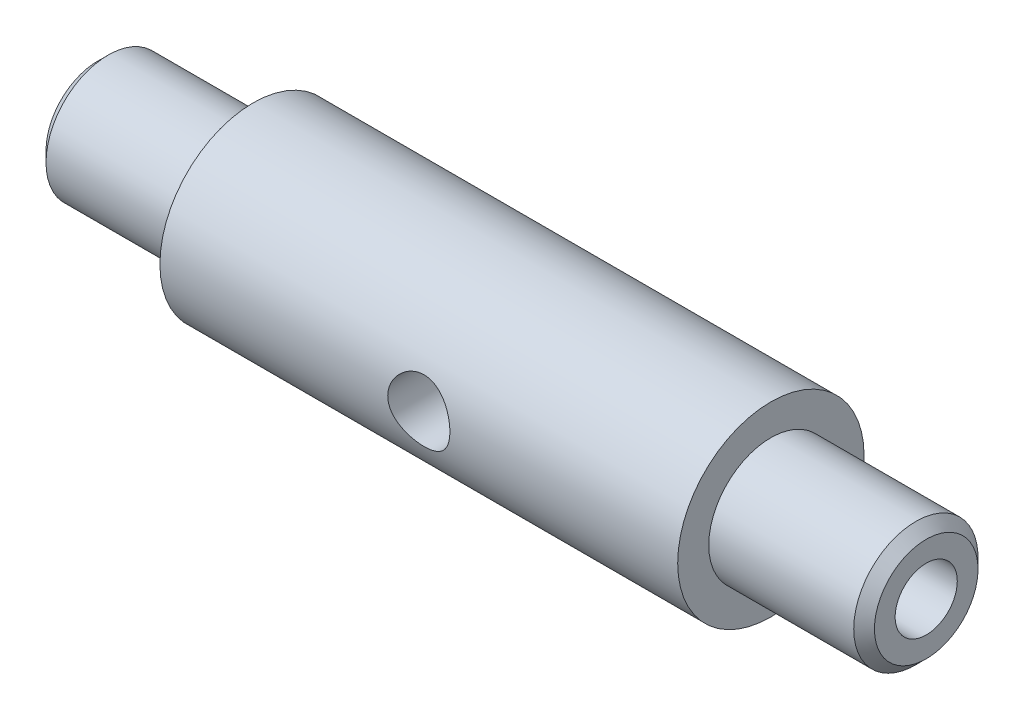
ISO-10303-21;
HEADER;
FILE_DESCRIPTION(('STEP AP214'),'2;1');
FILE_NAME('part.step','',(''),(''),'','','');
FILE_SCHEMA(('AUTOMOTIVE_DESIGN { 1 0 10303 214 1 1 1 1 }'));
ENDSEC;
DATA;
#1=APPLICATION_CONTEXT('core data for automotive mechanical design processes');
#2=APPLICATION_PROTOCOL_DEFINITION('international standard','automotive_design',2000,#1);
#3=PRODUCT_CONTEXT('',#1,'mechanical');
#4=PRODUCT('Part','Part','',(#3));
#5=PRODUCT_RELATED_PRODUCT_CATEGORY('part','',(#4));
#6=PRODUCT_DEFINITION_FORMATION('','',#4);
#7=PRODUCT_DEFINITION_CONTEXT('part definition',#1,'design');
#8=PRODUCT_DEFINITION('design','',#6,#7);
#9=PRODUCT_DEFINITION_SHAPE('','',#8);
#10=(LENGTH_UNIT() NAMED_UNIT(*) SI_UNIT(.MILLI.,.METRE.));
#11=(NAMED_UNIT(*) PLANE_ANGLE_UNIT() SI_UNIT($,.RADIAN.));
#12=(NAMED_UNIT(*) SI_UNIT($,.STERADIAN.) SOLID_ANGLE_UNIT());
#13=UNCERTAINTY_MEASURE_WITH_UNIT(LENGTH_MEASURE(1.E-05),#10,'distance_accuracy_value','');
#14=(GEOMETRIC_REPRESENTATION_CONTEXT(3) GLOBAL_UNCERTAINTY_ASSIGNED_CONTEXT((#13)) GLOBAL_UNIT_ASSIGNED_CONTEXT((#10,
#11,#12)) REPRESENTATION_CONTEXT('',''));
#15=CARTESIAN_POINT('',(0.,0.,0.));
#16=DIRECTION('',(0.,0.,1.));
#17=DIRECTION('',(1.,0.,0.));
#18=AXIS2_PLACEMENT_3D('',#15,#16,#17);
#19=CARTESIAN_POINT('',(0.,0.,22.));
#20=DIRECTION('',(0.,0.,-1.));
#21=DIRECTION('',(-1.,0.,0.));
#22=AXIS2_PLACEMENT_3D('',#19,#20,#21);
#23=CYLINDRICAL_SURFACE('',#22,3.);
#24=CARTESIAN_POINT('',(0.,0.,0.));
#25=DIRECTION('',(0.707106781186547,0.,-0.707106781186548));
#26=DIRECTION('',(-0.707106781186547,0.,-0.707106781186548));
#27=AXIS2_PLACEMENT_3D('',#24,#25,#26);
#28=ELLIPSE('',#27,4.24264068711929,3.);
#29=CARTESIAN_POINT('',(0.,-3.,0.));
#30=VERTEX_POINT('',#29);
#31=CARTESIAN_POINT('',(0.,3.,0.));
#32=VERTEX_POINT('',#31);
#33=EDGE_CURVE('E11',#30,#32,#28,.F.);
#34=ORIENTED_EDGE('',*,*,#33,.F.);
#35=CARTESIAN_POINT('',(0.,0.,0.));
#36=DIRECTION('',(-0.707106781186547,0.,-0.707106781186548));
#37=DIRECTION('',(0.707106781186547,0.,-0.707106781186548));
#38=AXIS2_PLACEMENT_3D('',#35,#36,#37);
#39=ELLIPSE('',#38,4.24264068711929,3.);
#40=EDGE_CURVE('E58',#32,#30,#39,.F.);
#41=ORIENTED_EDGE('',*,*,#40,.F.);
#42=EDGE_LOOP('',(#34,#41));
#43=FACE_BOUND('',#42,.T.);
#44=CARTESIAN_POINT('',(3.,0.,9.));
#45=CARTESIAN_POINT('',(3.00000076119492,0.16369008866017,9.00000045902832));
#46=CARTESIAN_POINT('',(2.98655920161835,0.32737558361565,8.99549308522634));
#47=CARTESIAN_POINT('',(2.93331267354834,0.649925282618917,8.97795630609842));
#48=CARTESIAN_POINT('',(2.89350496815323,0.808788984356453,8.96492601606458));
#49=CARTESIAN_POINT('',(2.78904226984785,1.11699836850533,8.93175923719328));
#50=CARTESIAN_POINT('',(2.72442881262219,1.2663594776581,8.9116346319256));
#51=CARTESIAN_POINT('',(2.57237648148496,1.55212481041597,8.86633337152025));
#52=CARTESIAN_POINT('',(2.4849331049922,1.68852647087612,8.84115572003334));
#53=CARTESIAN_POINT('',(2.28652258542374,1.9492250250668,8.78742283329015));
#54=CARTESIAN_POINT('',(2.17490629721852,2.07301110089493,8.75878669391354));
#55=CARTESIAN_POINT('',(1.9326985358803,2.30049807810625,8.70180944349364));
#56=CARTESIAN_POINT('',(1.80210289521446,2.40419455646839,8.67346839871647));
#57=CARTESIAN_POINT('',(1.52104465441062,2.59147482668358,8.61939997431821));
#58=CARTESIAN_POINT('',(1.37011878080363,2.6743945746631,8.59377117827064));
#59=CARTESIAN_POINT('',(1.05547171662436,2.81345662163316,8.54925916255803));
#60=CARTESIAN_POINT('',(0.891754448511769,2.86960709216029,8.53037388482237));
#61=CARTESIAN_POINT('',(0.561980335509869,2.95162038452749,8.50233909808132));
#62=CARTESIAN_POINT('',(0.396188374532807,2.97844034481531,8.49288287308834));
#63=CARTESIAN_POINT('',(0.0622087375323578,3.00402337000343,8.48386969888523));
#64=CARTESIAN_POINT('',(-0.105978182127571,3.00279510481416,8.4843096906819));
#65=CARTESIAN_POINT('',(-0.431809891332063,2.97305971111026,8.4947704502454));
#66=CARTESIAN_POINT('',(-0.589585208757056,2.94580173950098,8.50435247602599));
#67=CARTESIAN_POINT('',(-0.898180258820504,2.86681848854825,8.53129973173653));
#68=CARTESIAN_POINT('',(-1.04899915630521,2.81509027977561,8.54866589352323));
#69=CARTESIAN_POINT('',(-1.34223824877444,2.68781717418063,8.58953733393746));
#70=CARTESIAN_POINT('',(-1.48448407640858,2.61190214612179,8.61313697379352));
#71=CARTESIAN_POINT('',(-1.75461272483918,2.43866731890942,8.66377675727179));
#72=CARTESIAN_POINT('',(-1.88249138080014,2.34134133709202,8.69081789371391));
#73=CARTESIAN_POINT('',(-2.12727479448232,2.12204799804671,8.74701987503223));
#74=CARTESIAN_POINT('',(-2.24325808352721,1.99905945022893,8.77621768064528));
#75=CARTESIAN_POINT('',(-2.45319379999019,1.73501870991019,8.8322081516111));
#76=CARTESIAN_POINT('',(-2.54714411449349,1.59396478698244,8.85900058614202));
#77=CARTESIAN_POINT('',(-2.71108890070521,1.2958428391388,8.90751323813381));
#78=CARTESIAN_POINT('',(-2.7808364740222,1.13862982924901,8.92918050024118));
#79=CARTESIAN_POINT('',(-2.89260952186713,0.813807250093523,8.96461701433304));
#80=CARTESIAN_POINT('',(-2.93464462627031,0.646201314464861,8.97838900964638));
#81=CARTESIAN_POINT('',(-2.98816699806708,0.313151488587912,8.99602881214321));
#82=CARTESIAN_POINT('',(-3.00089942751825,0.147928799594539,9.00030005501184));
#83=CARTESIAN_POINT('',(-2.99900197920459,-0.182325209880712,8.99966708084482));
#84=CARTESIAN_POINT('',(-2.98437672006037,-0.347356557958951,8.99476441258087));
#85=CARTESIAN_POINT('',(-2.92916427679212,-0.667559598912766,8.97660074151313));
#86=CARTESIAN_POINT('',(-2.88934138185152,-0.822878420504529,8.96358596133577));
#87=CARTESIAN_POINT('',(-2.78581966659982,-1.12456787573872,8.9307554049021));
#88=CARTESIAN_POINT('',(-2.72211780159664,-1.27093736552582,8.91093876140025));
#89=CARTESIAN_POINT('',(-2.57078870447764,-1.55486488917982,8.86586793861869));
#90=CARTESIAN_POINT('',(-2.48257622015049,-1.69208987765144,8.84048444267358));
#91=CARTESIAN_POINT('',(-2.28541754995955,-1.95019449040676,8.78715761748787));
#92=CARTESIAN_POINT('',(-2.17646503190471,-2.07106910338673,8.75921350781483));
#93=CARTESIAN_POINT('',(-1.93506374698024,-2.2987575234189,8.70230543941334));
#94=CARTESIAN_POINT('',(-1.80177231921942,-2.40468290773731,8.67335283262284));
#95=CARTESIAN_POINT('',(-1.51868529656734,-2.59277256697072,8.61899919884126));
#96=CARTESIAN_POINT('',(-1.36888956409777,-2.67493664379304,8.59359820146007));
#97=CARTESIAN_POINT('',(-1.05698095413031,-2.81279079124908,8.54947175374151));
#98=CARTESIAN_POINT('',(-0.894893762493703,-2.86853439649506,8.53073282378936));
#99=CARTESIAN_POINT('',(-0.562864049867609,-2.95168400027807,8.50232496919349));
#100=CARTESIAN_POINT('',(-0.392925103786952,-2.97910276486182,8.49265195870918));
#101=CARTESIAN_POINT('',(-0.0594087118772512,-3.00382884743203,8.48393576622531));
#102=CARTESIAN_POINT('',(0.10404702086047,-3.0026107719252,8.48437200772245));
#103=CARTESIAN_POINT('',(0.428295224766187,-2.97372688034608,8.49453809471602));
#104=CARTESIAN_POINT('',(0.589087853865265,-2.94606263837576,8.50426738708085));
#105=CARTESIAN_POINT('',(0.900406989007417,-2.86611543938804,8.53153572914675));
#106=CARTESIAN_POINT('',(1.05107047501349,-2.81431003804654,8.54892294067433));
#107=CARTESIAN_POINT('',(1.34168222081481,-2.68793809727924,8.58949196455405));
#108=CARTESIAN_POINT('',(1.48162809356402,-2.61336650566142,8.61267506290179));
#109=CARTESIAN_POINT('',(1.75345100976873,-2.43978207775029,8.66348487678139));
#110=CARTESIAN_POINT('',(1.88470950569516,-2.33984472829374,8.69126134926411));
#111=CARTESIAN_POINT('',(2.1290694401526,-2.11992864940695,8.74750068849758));
#112=CARTESIAN_POINT('',(2.24216572706422,-1.99994425335445,8.77596374737117));
#113=CARTESIAN_POINT('',(2.45143323686754,-1.73772467076207,8.83170091576632));
#114=CARTESIAN_POINT('',(2.546773043253,-1.59480454049919,8.8588854540377));
#115=CARTESIAN_POINT('',(2.71197128655194,-1.29407207221987,8.90777973517836));
#116=CARTESIAN_POINT('',(2.78183623776613,-1.13626355439705,8.9294908772379));
#117=CARTESIAN_POINT('',(2.89116489746602,-0.817480941602928,8.96416545205626));
#118=CARTESIAN_POINT('',(2.93184739879013,-0.656963273029225,8.97747637267568));
#119=CARTESIAN_POINT('',(2.98626084203138,-0.33096124803074,8.99539221192665));
#120=CARTESIAN_POINT('',(2.99999923048961,-0.165478276706239,8.99999953595715));
#121=CARTESIAN_POINT('',(3.,0.,9.));
#122=B_SPLINE_CURVE_WITH_KNOTS('',3,(#44,#45,#46,#47,#48,#49,#50,#51,#52,#53,#54,#55,#56,#57,
#58,#59,#60,#61,#62,#63,#64,#65,#66,#67,#68,#69,#70,#71,#72,#73,#74,#75,#76,#77,#78,#79,#80,#81,
#82,#83,#84,#85,#86,#87,#88,#89,#90,#91,#92,#93,#94,#95,#96,#97,#98,#99,#100,#101,#102,#103,
#104,#105,#106,#107,#108,#109,#110,#111,#112,#113,#114,#115,#116,#117,#118,#119,#120,#121),
.UNSPECIFIED.,.T.,.F.,(4,2,2,2,2,2,2,2,2,2,2,2,2,2,2,2,2,2,2,2,2,2,2,2,2,2,2,2,2,2,2,2,2,2,2,2,
2,2,4),(0.,0.490461318078033,0.980973555802562,1.47066801861082,1.9604591333973,
2.46554052848268,2.97073299862591,3.49045154470411,4.010011340785,4.5120577722552,
5.01394901962456,5.49290479653841,5.97191792566446,6.45864513465392,6.94551307674622,
7.45779917434101,7.97013437899855,8.48755216951073,9.00479006631625,9.49960749525509,
9.99434139492529,10.4747447393464,10.9552093585231,11.4483119953121,11.9415654246567,
12.4572306864226,12.9729002470499,13.4875204148031,14.0019085411752,14.4898699819277,
14.9778023805413,15.4564676124125,15.9352391452793,16.4349020007541,16.9347063337134,
17.453989825053,17.9731404345737,18.4690967512144,18.9649159811442),.UNSPECIFIED.);
#123=CARTESIAN_POINT('',(3.,0.,9.));
#124=VERTEX_POINT('',#123);
#125=EDGE_CURVE('E81',#124,#124,#122,.T.);
#126=ORIENTED_EDGE('',*,*,#125,.T.);
#127=EDGE_LOOP('',(#126));
#128=FACE_BOUND('',#127,.T.);
#129=ADVANCED_FACE('F43',(#43,#128),#23,.F.);
#130=CARTESIAN_POINT('',(-40.,0.,0.));
#131=DIRECTION('',(-1.,0.,0.));
#132=DIRECTION('',(0.,0.,1.));
#133=AXIS2_PLACEMENT_3D('',#130,#131,#132);
#134=CYLINDRICAL_SURFACE('',#133,9.);
#135=CARTESIAN_POINT('',(-25.,0.,0.));
#136=DIRECTION('',(-1.,0.,0.));
#137=DIRECTION('',(0.,0.,1.));
#138=AXIS2_PLACEMENT_3D('',#135,#136,#137);
#139=CIRCLE('',#138,9.);
#140=CARTESIAN_POINT('',(-25.,0.,9.));
#141=VERTEX_POINT('',#140);
#142=EDGE_CURVE('E142',#141,#141,#139,.T.);
#143=ORIENTED_EDGE('',*,*,#142,.F.);
#144=EDGE_LOOP('',(#143));
#145=FACE_BOUND('',#144,.T.);
#146=CARTESIAN_POINT('',(25.,0.,0.));
#147=DIRECTION('',(-1.,0.,0.));
#148=DIRECTION('',(0.,0.,1.));
#149=AXIS2_PLACEMENT_3D('',#146,#147,#148);
#150=CIRCLE('',#149,9.);
#151=CARTESIAN_POINT('',(25.,0.,9.));
#152=VERTEX_POINT('',#151);
#153=EDGE_CURVE('E145',#152,#152,#150,.T.);
#154=ORIENTED_EDGE('',*,*,#153,.T.);
#155=EDGE_LOOP('',(#154));
#156=FACE_BOUND('',#155,.T.);
#157=CARTESIAN_POINT('',(-3.,0.,-9.));
#158=CARTESIAN_POINT('',(-3.00000076119492,0.16369008866017,-9.00000045902832));
#159=CARTESIAN_POINT('',(-2.98655920161835,0.32737558361565,-8.99549308522634));
#160=CARTESIAN_POINT('',(-2.93331267354834,0.649925282618917,-8.97795630609842));
#161=CARTESIAN_POINT('',(-2.89350496815323,0.808788984356453,-8.96492601606458));
#162=CARTESIAN_POINT('',(-2.78904226984785,1.11699836850533,-8.93175923719328));
#163=CARTESIAN_POINT('',(-2.72442881262219,1.2663594776581,-8.9116346319256));
#164=CARTESIAN_POINT('',(-2.57237648148496,1.55212481041597,-8.86633337152025));
#165=CARTESIAN_POINT('',(-2.4849331049922,1.68852647087612,-8.84115572003334));
#166=CARTESIAN_POINT('',(-2.28652258542374,1.9492250250668,-8.78742283329015));
#167=CARTESIAN_POINT('',(-2.17490629721852,2.07301110089493,-8.75878669391354));
#168=CARTESIAN_POINT('',(-1.9326985358803,2.30049807810625,-8.70180944349364));
#169=CARTESIAN_POINT('',(-1.80210289521446,2.40419455646839,-8.67346839871647));
#170=CARTESIAN_POINT('',(-1.52104465441062,2.59147482668358,-8.61939997431821));
#171=CARTESIAN_POINT('',(-1.37011878080363,2.6743945746631,-8.59377117827064));
#172=CARTESIAN_POINT('',(-1.05547171662436,2.81345662163316,-8.54925916255803));
#173=CARTESIAN_POINT('',(-0.891754448511769,2.86960709216029,-8.53037388482237));
#174=CARTESIAN_POINT('',(-0.561980335509869,2.95162038452749,-8.50233909808132));
#175=CARTESIAN_POINT('',(-0.396188374532807,2.97844034481531,-8.49288287308834));
#176=CARTESIAN_POINT('',(-0.0622087375323578,3.00402337000343,-8.48386969888523));
#177=CARTESIAN_POINT('',(0.105978182127571,3.00279510481416,-8.4843096906819));
#178=CARTESIAN_POINT('',(0.431809891332063,2.97305971111026,-8.4947704502454));
#179=CARTESIAN_POINT('',(0.589585208757056,2.94580173950098,-8.50435247602599));
#180=CARTESIAN_POINT('',(0.898180258820504,2.86681848854825,-8.53129973173653));
#181=CARTESIAN_POINT('',(1.04899915630521,2.81509027977561,-8.54866589352323));
#182=CARTESIAN_POINT('',(1.34223824877444,2.68781717418063,-8.58953733393746));
#183=CARTESIAN_POINT('',(1.48448407640858,2.61190214612179,-8.61313697379352));
#184=CARTESIAN_POINT('',(1.75461272483918,2.43866731890942,-8.66377675727179));
#185=CARTESIAN_POINT('',(1.88249138080014,2.34134133709202,-8.69081789371391));
#186=CARTESIAN_POINT('',(2.12727479448232,2.12204799804671,-8.74701987503223));
#187=CARTESIAN_POINT('',(2.24325808352721,1.99905945022893,-8.77621768064528));
#188=CARTESIAN_POINT('',(2.45319379999019,1.73501870991019,-8.8322081516111));
#189=CARTESIAN_POINT('',(2.54714411449349,1.59396478698244,-8.85900058614202));
#190=CARTESIAN_POINT('',(2.71108890070521,1.2958428391388,-8.90751323813381));
#191=CARTESIAN_POINT('',(2.7808364740222,1.13862982924901,-8.92918050024118));
#192=CARTESIAN_POINT('',(2.89260952186713,0.813807250093523,-8.96461701433304));
#193=CARTESIAN_POINT('',(2.93464462627031,0.646201314464861,-8.97838900964638));
#194=CARTESIAN_POINT('',(2.98816699806708,0.313151488587912,-8.99602881214321));
#195=CARTESIAN_POINT('',(3.00089942751825,0.147928799594539,-9.00030005501184));
#196=CARTESIAN_POINT('',(2.99900197920459,-0.182325209880712,-8.99966708084482));
#197=CARTESIAN_POINT('',(2.98437672006037,-0.347356557958951,-8.99476441258087));
#198=CARTESIAN_POINT('',(2.92916427679212,-0.667559598912766,-8.97660074151313));
#199=CARTESIAN_POINT('',(2.88934138185152,-0.822878420504529,-8.96358596133577));
#200=CARTESIAN_POINT('',(2.78581966659982,-1.12456787573872,-8.9307554049021));
#201=CARTESIAN_POINT('',(2.72211780159664,-1.27093736552582,-8.91093876140025));
#202=CARTESIAN_POINT('',(2.57078870447764,-1.55486488917982,-8.86586793861869));
#203=CARTESIAN_POINT('',(2.48257622015049,-1.69208987765144,-8.84048444267358));
#204=CARTESIAN_POINT('',(2.28541754995955,-1.95019449040676,-8.78715761748787));
#205=CARTESIAN_POINT('',(2.17646503190471,-2.07106910338673,-8.75921350781483));
#206=CARTESIAN_POINT('',(1.93506374698024,-2.2987575234189,-8.70230543941334));
#207=CARTESIAN_POINT('',(1.80177231921942,-2.40468290773731,-8.67335283262284));
#208=CARTESIAN_POINT('',(1.51868529656734,-2.59277256697072,-8.61899919884126));
#209=CARTESIAN_POINT('',(1.36888956409777,-2.67493664379304,-8.59359820146007));
#210=CARTESIAN_POINT('',(1.05698095413031,-2.81279079124908,-8.54947175374151));
#211=CARTESIAN_POINT('',(0.894893762493703,-2.86853439649506,-8.53073282378936));
#212=CARTESIAN_POINT('',(0.562864049867609,-2.95168400027807,-8.50232496919349));
#213=CARTESIAN_POINT('',(0.392925103786952,-2.97910276486182,-8.49265195870918));
#214=CARTESIAN_POINT('',(0.0594087118772512,-3.00382884743203,-8.48393576622531));
#215=CARTESIAN_POINT('',(-0.10404702086047,-3.0026107719252,-8.48437200772245));
#216=CARTESIAN_POINT('',(-0.428295224766187,-2.97372688034608,-8.49453809471602));
#217=CARTESIAN_POINT('',(-0.589087853865265,-2.94606263837576,-8.50426738708085));
#218=CARTESIAN_POINT('',(-0.900406989007417,-2.86611543938804,-8.53153572914675));
#219=CARTESIAN_POINT('',(-1.05107047501349,-2.81431003804654,-8.54892294067433));
#220=CARTESIAN_POINT('',(-1.34168222081481,-2.68793809727924,-8.58949196455405));
#221=CARTESIAN_POINT('',(-1.48162809356402,-2.61336650566142,-8.61267506290179));
#222=CARTESIAN_POINT('',(-1.75345100976873,-2.43978207775029,-8.66348487678139));
#223=CARTESIAN_POINT('',(-1.88470950569516,-2.33984472829374,-8.69126134926411));
#224=CARTESIAN_POINT('',(-2.1290694401526,-2.11992864940695,-8.74750068849758));
#225=CARTESIAN_POINT('',(-2.24216572706422,-1.99994425335445,-8.77596374737117));
#226=CARTESIAN_POINT('',(-2.45143323686754,-1.73772467076207,-8.83170091576632));
#227=CARTESIAN_POINT('',(-2.546773043253,-1.59480454049919,-8.8588854540377));
#228=CARTESIAN_POINT('',(-2.71197128655194,-1.29407207221987,-8.90777973517836));
#229=CARTESIAN_POINT('',(-2.78183623776613,-1.13626355439705,-8.9294908772379));
#230=CARTESIAN_POINT('',(-2.89116489746602,-0.817480941602928,-8.96416545205626));
#231=CARTESIAN_POINT('',(-2.93184739879013,-0.656963273029225,-8.97747637267568));
#232=CARTESIAN_POINT('',(-2.98626084203138,-0.33096124803074,-8.99539221192665));
#233=CARTESIAN_POINT('',(-2.99999923048961,-0.165478276706239,-8.99999953595715));
#234=CARTESIAN_POINT('',(-3.,0.,-9.));
#235=B_SPLINE_CURVE_WITH_KNOTS('',3,(#157,#158,#159,#160,#161,#162,#163,#164,#165,#166,#167,
#168,#169,#170,#171,#172,#173,#174,#175,#176,#177,#178,#179,#180,#181,#182,#183,#184,#185,#186,
#187,#188,#189,#190,#191,#192,#193,#194,#195,#196,#197,#198,#199,#200,#201,#202,#203,#204,#205,
#206,#207,#208,#209,#210,#211,#212,#213,#214,#215,#216,#217,#218,#219,#220,#221,#222,#223,#224,
#225,#226,#227,#228,#229,#230,#231,#232,#233,#234),.UNSPECIFIED.,.T.,.F.,(4,2,2,2,2,2,2,2,2,2,2,
2,2,2,2,2,2,2,2,2,2,2,2,2,2,2,2,2,2,2,2,2,2,2,2,2,2,2,4),(0.,0.490461318078033,
0.980973555802562,1.47066801861082,1.9604591333973,2.46554052848268,2.97073299862591,
3.49045154470411,4.010011340785,4.5120577722552,5.01394901962456,5.49290479653841,
5.97191792566446,6.45864513465392,6.94551307674622,7.45779917434101,7.97013437899855,
8.48755216951073,9.00479006631625,9.49960749525509,9.99434139492529,10.4747447393464,
10.9552093585231,11.4483119953121,11.9415654246567,12.4572306864226,12.9729002470499,
13.4875204148031,14.0019085411752,14.4898699819277,14.9778023805413,15.4564676124125,
15.9352391452793,16.4349020007541,16.9347063337134,17.453989825053,17.9731404345737,
18.4690967512144,18.9649159811442),.UNSPECIFIED.);
#236=CARTESIAN_POINT('',(-3.,0.,-9.));
#237=VERTEX_POINT('',#236);
#238=EDGE_CURVE('E91',#237,#237,#235,.T.);
#239=ORIENTED_EDGE('',*,*,#238,.F.);
#240=EDGE_LOOP('',(#239));
#241=FACE_BOUND('',#240,.T.);
#242=ORIENTED_EDGE('',*,*,#125,.F.);
#243=EDGE_LOOP('',(#242));
#244=FACE_BOUND('',#243,.T.);
#245=ADVANCED_FACE('F96',(#145,#156,#241,#244),#134,.T.);
#246=CARTESIAN_POINT('',(-40.,0.,0.));
#247=DIRECTION('',(1.,0.,0.));
#248=DIRECTION('',(0.,0.,-1.));
#249=AXIS2_PLACEMENT_3D('',#246,#247,#248);
#250=PLANE('',#249);
#251=CARTESIAN_POINT('',(-40.,0.,0.));
#252=DIRECTION('',(-1.,0.,0.));
#253=DIRECTION('',(0.,0.,1.));
#254=AXIS2_PLACEMENT_3D('',#251,#252,#253);
#255=CIRCLE('',#254,5.);
#256=CARTESIAN_POINT('',(-40.,0.,5.));
#257=VERTEX_POINT('',#256);
#258=EDGE_CURVE('E74',#257,#257,#255,.T.);
#259=ORIENTED_EDGE('',*,*,#258,.T.);
#260=EDGE_LOOP('',(#259));
#261=FACE_BOUND('',#260,.T.);
#262=ADVANCED_FACE('F45',(#261),#250,.F.);
#263=CARTESIAN_POINT('',(-39.,0.,0.));
#264=DIRECTION('',(1.,0.,0.));
#265=DIRECTION('',(0.,0.,-1.));
#266=AXIS2_PLACEMENT_3D('',#263,#264,#265);
#267=CONICAL_SURFACE('',#266,6.,0.785398163397451);
#268=ORIENTED_EDGE('',*,*,#258,.F.);
#269=EDGE_LOOP('',(#268));
#270=FACE_BOUND('',#269,.T.);
#271=CARTESIAN_POINT('',(-39.,0.,0.));
#272=DIRECTION('',(-1.,0.,0.));
#273=DIRECTION('',(0.,0.,1.));
#274=AXIS2_PLACEMENT_3D('',#271,#272,#273);
#275=CIRCLE('',#274,6.);
#276=CARTESIAN_POINT('',(-39.,0.,6.));
#277=VERTEX_POINT('',#276);
#278=EDGE_CURVE('E181',#277,#277,#275,.T.);
#279=ORIENTED_EDGE('',*,*,#278,.T.);
#280=EDGE_LOOP('',(#279));
#281=FACE_BOUND('',#280,.T.);
#282=ADVANCED_FACE('F137',(#270,#281),#267,.T.);
#283=CARTESIAN_POINT('',(-40.,0.,0.));
#284=DIRECTION('',(-1.,0.,0.));
#285=DIRECTION('',(0.,0.,1.));
#286=AXIS2_PLACEMENT_3D('',#283,#284,#285);
#287=CYLINDRICAL_SURFACE('',#286,6.);
#288=ORIENTED_EDGE('',*,*,#278,.F.);
#289=EDGE_LOOP('',(#288));
#290=FACE_BOUND('',#289,.T.);
#291=CARTESIAN_POINT('',(-25.,0.,0.));
#292=DIRECTION('',(-1.,0.,0.));
#293=DIRECTION('',(0.,0.,1.));
#294=AXIS2_PLACEMENT_3D('',#291,#292,#293);
#295=CIRCLE('',#294,6.);
#296=CARTESIAN_POINT('',(-25.,0.,6.));
#297=VERTEX_POINT('',#296);
#298=EDGE_CURVE('E177',#297,#297,#295,.T.);
#299=ORIENTED_EDGE('',*,*,#298,.T.);
#300=EDGE_LOOP('',(#299));
#301=FACE_BOUND('',#300,.T.);
#302=ADVANCED_FACE('F125',(#290,#301),#287,.T.);
#303=CARTESIAN_POINT('',(-25.,6.,0.));
#304=DIRECTION('',(1.,0.,0.));
#305=DIRECTION('',(0.,0.,-1.));
#306=AXIS2_PLACEMENT_3D('',#303,#304,#305);
#307=PLANE('',#306);
#308=ORIENTED_EDGE('',*,*,#298,.F.);
#309=EDGE_LOOP('',(#308));
#310=FACE_BOUND('',#309,.T.);
#311=ORIENTED_EDGE('',*,*,#142,.T.);
#312=EDGE_LOOP('',(#311));
#313=FACE_BOUND('',#312,.T.);
#314=ADVANCED_FACE('F120',(#310,#313),#307,.F.);
#315=CARTESIAN_POINT('',(25.,9.,0.));
#316=DIRECTION('',(-1.,0.,0.));
#317=DIRECTION('',(0.,0.,1.));
#318=AXIS2_PLACEMENT_3D('',#315,#316,#317);
#319=PLANE('',#318);
#320=ORIENTED_EDGE('',*,*,#153,.F.);
#321=EDGE_LOOP('',(#320));
#322=FACE_BOUND('',#321,.T.);
#323=CARTESIAN_POINT('',(25.,0.,0.));
#324=DIRECTION('',(-1.,0.,0.));
#325=DIRECTION('',(0.,0.,1.));
#326=AXIS2_PLACEMENT_3D('',#323,#324,#325);
#327=CIRCLE('',#326,6.);
#328=CARTESIAN_POINT('',(25.,0.,6.));
#329=VERTEX_POINT('',#328);
#330=EDGE_CURVE('E169',#329,#329,#327,.T.);
#331=ORIENTED_EDGE('',*,*,#330,.T.);
#332=EDGE_LOOP('',(#331));
#333=FACE_BOUND('',#332,.T.);
#334=ADVANCED_FACE('F117',(#322,#333),#319,.F.);
#335=CARTESIAN_POINT('',(-40.,0.,0.));
#336=DIRECTION('',(-1.,0.,0.));
#337=DIRECTION('',(0.,0.,1.));
#338=AXIS2_PLACEMENT_3D('',#335,#336,#337);
#339=CYLINDRICAL_SURFACE('',#338,6.);
#340=ORIENTED_EDGE('',*,*,#330,.F.);
#341=EDGE_LOOP('',(#340));
#342=FACE_BOUND('',#341,.T.);
#343=CARTESIAN_POINT('',(39.,0.,0.));
#344=DIRECTION('',(-1.,0.,0.));
#345=DIRECTION('',(0.,0.,1.));
#346=AXIS2_PLACEMENT_3D('',#343,#344,#345);
#347=CIRCLE('',#346,6.);
#348=CARTESIAN_POINT('',(39.,0.,6.));
#349=VERTEX_POINT('',#348);
#350=EDGE_CURVE('E165',#349,#349,#347,.T.);
#351=ORIENTED_EDGE('',*,*,#350,.T.);
#352=EDGE_LOOP('',(#351));
#353=FACE_BOUND('',#352,.T.);
#354=ADVANCED_FACE('F114',(#342,#353),#339,.T.);
#355=CARTESIAN_POINT('',(40.,0.,0.));
#356=DIRECTION('',(-1.,0.,0.));
#357=DIRECTION('',(0.,0.,1.));
#358=AXIS2_PLACEMENT_3D('',#355,#356,#357);
#359=CONICAL_SURFACE('',#358,5.,0.785398163397446);
#360=ORIENTED_EDGE('',*,*,#350,.F.);
#361=EDGE_LOOP('',(#360));
#362=FACE_BOUND('',#361,.T.);
#363=CARTESIAN_POINT('',(40.,0.,0.));
#364=DIRECTION('',(-1.,0.,0.));
#365=DIRECTION('',(0.,0.,1.));
#366=AXIS2_PLACEMENT_3D('',#363,#364,#365);
#367=CIRCLE('',#366,5.);
#368=CARTESIAN_POINT('',(40.,0.,5.));
#369=VERTEX_POINT('',#368);
#370=EDGE_CURVE('E90',#369,#369,#367,.T.);
#371=ORIENTED_EDGE('',*,*,#370,.T.);
#372=EDGE_LOOP('',(#371));
#373=FACE_BOUND('',#372,.T.);
#374=ADVANCED_FACE('F110',(#362,#373),#359,.T.);
#375=CARTESIAN_POINT('',(40.,5.,0.));
#376=DIRECTION('',(-1.,0.,0.));
#377=DIRECTION('',(0.,0.,1.));
#378=AXIS2_PLACEMENT_3D('',#375,#376,#377);
#379=PLANE('',#378);
#380=CARTESIAN_POINT('',(40.,0.,0.));
#381=DIRECTION('',(1.,0.,0.));
#382=DIRECTION('',(0.,0.,-1.));
#383=AXIS2_PLACEMENT_3D('',#380,#381,#382);
#384=CIRCLE('',#383,3.);
#385=CARTESIAN_POINT('',(40.,0.,-3.));
#386=VERTEX_POINT('',#385);
#387=EDGE_CURVE('E154',#386,#386,#384,.T.);
#388=ORIENTED_EDGE('',*,*,#387,.F.);
#389=EDGE_LOOP('',(#388));
#390=FACE_BOUND('',#389,.T.);
#391=ORIENTED_EDGE('',*,*,#370,.F.);
#392=EDGE_LOOP('',(#391));
#393=FACE_BOUND('',#392,.T.);
#394=ADVANCED_FACE('F105',(#390,#393),#379,.F.);
#395=CARTESIAN_POINT('',(0.,0.,0.));
#396=DIRECTION('',(0.707106781186547,0.,-0.707106781186548));
#397=DIRECTION('',(-0.707106781186547,0.,-0.707106781186548));
#398=AXIS2_PLACEMENT_3D('',#395,#396,#397);
#399=ELLIPSE('',#398,4.24264068711929,3.);
#400=EDGE_CURVE('E52',#30,#32,#399,.T.);
#401=ORIENTED_EDGE('',*,*,#400,.F.);
#402=CARTESIAN_POINT('',(0.,0.,0.));
#403=DIRECTION('',(-0.707106781186547,0.,-0.707106781186548));
#404=DIRECTION('',(0.707106781186547,0.,-0.707106781186548));
#405=AXIS2_PLACEMENT_3D('',#402,#403,#404);
#406=ELLIPSE('',#405,4.24264068711929,3.);
#407=EDGE_CURVE('E63',#32,#30,#406,.T.);
#408=ORIENTED_EDGE('',*,*,#407,.F.);
#409=EDGE_LOOP('',(#401,#408));
#410=FACE_BOUND('',#409,.T.);
#411=ORIENTED_EDGE('',*,*,#238,.T.);
#412=EDGE_LOOP('',(#411));
#413=FACE_BOUND('',#412,.T.);
#414=ADVANCED_FACE('F77',(#410,#413),#23,.F.);
#415=CARTESIAN_POINT('',(-5.,0.,0.));
#416=DIRECTION('',(1.,0.,0.));
#417=DIRECTION('',(0.,0.,-1.));
#418=AXIS2_PLACEMENT_3D('',#415,#416,#417);
#419=PLANE('',#418);
#420=CARTESIAN_POINT('',(-5.,0.,0.));
#421=DIRECTION('',(1.,0.,0.));
#422=DIRECTION('',(0.,0.,-1.));
#423=AXIS2_PLACEMENT_3D('',#420,#421,#422);
#424=CIRCLE('',#423,3.);
#425=CARTESIAN_POINT('',(-5.,0.,-3.));
#426=VERTEX_POINT('',#425);
#427=EDGE_CURVE('E151',#426,#426,#424,.T.);
#428=ORIENTED_EDGE('',*,*,#427,.T.);
#429=EDGE_LOOP('',(#428));
#430=FACE_BOUND('',#429,.T.);
#431=ADVANCED_FACE('F104',(#430),#419,.T.);
#432=CARTESIAN_POINT('',(-5.,0.,0.));
#433=DIRECTION('',(1.,0.,0.));
#434=DIRECTION('',(0.,0.,-1.));
#435=AXIS2_PLACEMENT_3D('',#432,#433,#434);
#436=CYLINDRICAL_SURFACE('',#435,3.);
#437=ORIENTED_EDGE('',*,*,#400,.T.);
#438=ORIENTED_EDGE('',*,*,#40,.T.);
#439=EDGE_LOOP('',(#437,#438));
#440=FACE_BOUND('',#439,.T.);
#441=ORIENTED_EDGE('',*,*,#427,.F.);
#442=EDGE_LOOP('',(#441));
#443=FACE_BOUND('',#442,.T.);
#444=ADVANCED_FACE('F71',(#440,#443),#436,.F.);
#445=ORIENTED_EDGE('',*,*,#33,.T.);
#446=ORIENTED_EDGE('',*,*,#407,.T.);
#447=EDGE_LOOP('',(#445,#446));
#448=FACE_BOUND('',#447,.T.);
#449=ORIENTED_EDGE('',*,*,#387,.T.);
#450=EDGE_LOOP('',(#449));
#451=FACE_BOUND('',#450,.T.);
#452=ADVANCED_FACE('F64',(#448,#451),#436,.F.);
#453=CLOSED_SHELL('',(#129,#245,#262,#282,#302,#314,#334,#354,#374,#394,#414,#431,#444,#452));
#454=MANIFOLD_SOLID_BREP('B2',#453);
#455=ADVANCED_BREP_SHAPE_REPRESENTATION('',(#18,#454),#14);
#456=SHAPE_DEFINITION_REPRESENTATION(#9,#455);
ENDSEC;
END-ISO-10303-21;
